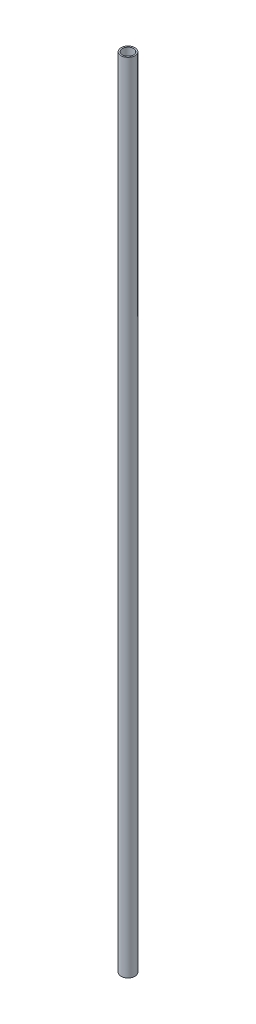
ISO-10303-21;
HEADER;
FILE_DESCRIPTION(('STEP AP214'),'2;1');
FILE_NAME('part.step','',(''),(''),'','','');
FILE_SCHEMA(('AUTOMOTIVE_DESIGN { 1 0 10303 214 1 1 1 1 }'));
ENDSEC;
DATA;
#1=APPLICATION_CONTEXT('core data for automotive mechanical design processes');
#2=APPLICATION_PROTOCOL_DEFINITION('international standard','automotive_design',2000,#1);
#3=PRODUCT_CONTEXT('',#1,'mechanical');
#4=PRODUCT('Part','Part','',(#3));
#5=PRODUCT_RELATED_PRODUCT_CATEGORY('part','',(#4));
#6=PRODUCT_DEFINITION_FORMATION('','',#4);
#7=PRODUCT_DEFINITION_CONTEXT('part definition',#1,'design');
#8=PRODUCT_DEFINITION('design','',#6,#7);
#9=PRODUCT_DEFINITION_SHAPE('','',#8);
#10=(LENGTH_UNIT() NAMED_UNIT(*) SI_UNIT(.MILLI.,.METRE.));
#11=(NAMED_UNIT(*) PLANE_ANGLE_UNIT() SI_UNIT($,.RADIAN.));
#12=(NAMED_UNIT(*) SI_UNIT($,.STERADIAN.) SOLID_ANGLE_UNIT());
#13=UNCERTAINTY_MEASURE_WITH_UNIT(LENGTH_MEASURE(1.E-05),#10,'distance_accuracy_value','');
#14=(GEOMETRIC_REPRESENTATION_CONTEXT(3) GLOBAL_UNCERTAINTY_ASSIGNED_CONTEXT((#13)) GLOBAL_UNIT_ASSIGNED_CONTEXT((#10,
#11,#12)) REPRESENTATION_CONTEXT('',''));
#15=CARTESIAN_POINT('',(0.,0.,0.));
#16=DIRECTION('',(0.,0.,1.));
#17=DIRECTION('',(1.,0.,0.));
#18=AXIS2_PLACEMENT_3D('',#15,#16,#17);
#19=CARTESIAN_POINT('',(0.,143.5,0.));
#20=DIRECTION('',(0.,1.,0.));
#21=DIRECTION('',(0.,0.,1.));
#22=AXIS2_PLACEMENT_3D('',#19,#20,#21);
#23=PLANE('',#22);
#24=CARTESIAN_POINT('',(0.,143.5,0.));
#25=DIRECTION('',(0.,1.,0.));
#26=DIRECTION('',(0.,0.,1.));
#27=AXIS2_PLACEMENT_3D('',#24,#25,#26);
#28=CIRCLE('',#27,2.5);
#29=CARTESIAN_POINT('',(0.,143.5,2.5));
#30=VERTEX_POINT('',#29);
#31=EDGE_CURVE('E10',#30,#30,#28,.T.);
#32=ORIENTED_EDGE('',*,*,#31,.T.);
#33=EDGE_LOOP('',(#32));
#34=FACE_BOUND('',#33,.T.);
#35=CARTESIAN_POINT('',(0.,143.5,0.));
#36=DIRECTION('',(0.,1.,0.));
#37=DIRECTION('',(0.,0.,1.));
#38=AXIS2_PLACEMENT_3D('',#35,#36,#37);
#39=CIRCLE('',#38,2.);
#40=CARTESIAN_POINT('',(0.,143.5,2.));
#41=VERTEX_POINT('',#40);
#42=EDGE_CURVE('E44',#41,#41,#39,.T.);
#43=ORIENTED_EDGE('',*,*,#42,.F.);
#44=EDGE_LOOP('',(#43));
#45=FACE_BOUND('',#44,.T.);
#46=ADVANCED_FACE('F33',(#34,#45),#23,.T.);
#47=CARTESIAN_POINT('',(0.,-143.5,0.));
#48=DIRECTION('',(0.,1.,0.));
#49=DIRECTION('',(0.,0.,1.));
#50=AXIS2_PLACEMENT_3D('',#47,#48,#49);
#51=PLANE('',#50);
#52=CARTESIAN_POINT('',(0.,-143.5,0.));
#53=DIRECTION('',(0.,1.,0.));
#54=DIRECTION('',(0.,0.,1.));
#55=AXIS2_PLACEMENT_3D('',#52,#53,#54);
#56=CIRCLE('',#55,2.5);
#57=CARTESIAN_POINT('',(0.,-143.5,2.5));
#58=VERTEX_POINT('',#57);
#59=EDGE_CURVE('E37',#58,#58,#56,.T.);
#60=ORIENTED_EDGE('',*,*,#59,.F.);
#61=EDGE_LOOP('',(#60));
#62=FACE_BOUND('',#61,.T.);
#63=CARTESIAN_POINT('',(0.,-143.5,0.));
#64=DIRECTION('',(0.,1.,0.));
#65=DIRECTION('',(0.,0.,1.));
#66=AXIS2_PLACEMENT_3D('',#63,#64,#65);
#67=CIRCLE('',#66,2.);
#68=CARTESIAN_POINT('',(0.,-143.5,2.));
#69=VERTEX_POINT('',#68);
#70=EDGE_CURVE('E46',#69,#69,#67,.T.);
#71=ORIENTED_EDGE('',*,*,#70,.T.);
#72=EDGE_LOOP('',(#71));
#73=FACE_BOUND('',#72,.T.);
#74=ADVANCED_FACE('F56',(#62,#73),#51,.F.);
#75=CARTESIAN_POINT('',(0.,143.5,0.));
#76=DIRECTION('',(0.,-1.,0.));
#77=DIRECTION('',(0.,0.,-1.));
#78=AXIS2_PLACEMENT_3D('',#75,#76,#77);
#79=CYLINDRICAL_SURFACE('',#78,2.5);
#80=ORIENTED_EDGE('',*,*,#31,.F.);
#81=EDGE_LOOP('',(#80));
#82=FACE_BOUND('',#81,.T.);
#83=ORIENTED_EDGE('',*,*,#59,.T.);
#84=EDGE_LOOP('',(#83));
#85=FACE_BOUND('',#84,.T.);
#86=ADVANCED_FACE('F35',(#82,#85),#79,.T.);
#87=CARTESIAN_POINT('',(0.,143.5,0.));
#88=DIRECTION('',(0.,-1.,0.));
#89=DIRECTION('',(0.,0.,-1.));
#90=AXIS2_PLACEMENT_3D('',#87,#88,#89);
#91=CYLINDRICAL_SURFACE('',#90,2.);
#92=ORIENTED_EDGE('',*,*,#42,.T.);
#93=EDGE_LOOP('',(#92));
#94=FACE_BOUND('',#93,.T.);
#95=ORIENTED_EDGE('',*,*,#70,.F.);
#96=EDGE_LOOP('',(#95));
#97=FACE_BOUND('',#96,.T.);
#98=ADVANCED_FACE('F52',(#94,#97),#91,.F.);
#99=CLOSED_SHELL('',(#46,#74,#86,#98));
#100=MANIFOLD_SOLID_BREP('B2',#99);
#101=ADVANCED_BREP_SHAPE_REPRESENTATION('',(#18,#100),#14);
#102=SHAPE_DEFINITION_REPRESENTATION(#9,#101);
ENDSEC;
END-ISO-10303-21;
